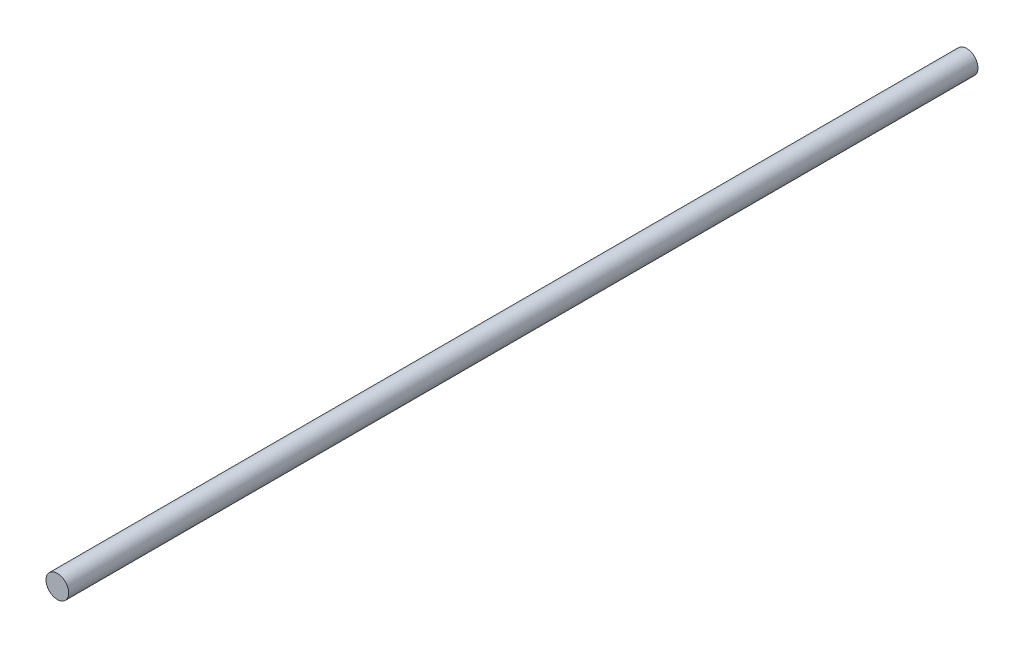
ISO-10303-21;
HEADER;
FILE_DESCRIPTION(('STEP AP214'),'2;1');
FILE_NAME('part.step','',(''),(''),'','','');
FILE_SCHEMA(('AUTOMOTIVE_DESIGN { 1 0 10303 214 1 1 1 1 }'));
ENDSEC;
DATA;
#1=APPLICATION_CONTEXT('core data for automotive mechanical design processes');
#2=APPLICATION_PROTOCOL_DEFINITION('international standard','automotive_design',2000,#1);
#3=PRODUCT_CONTEXT('',#1,'mechanical');
#4=PRODUCT('Part','Part','',(#3));
#5=PRODUCT_RELATED_PRODUCT_CATEGORY('part','',(#4));
#6=PRODUCT_DEFINITION_FORMATION('','',#4);
#7=PRODUCT_DEFINITION_CONTEXT('part definition',#1,'design');
#8=PRODUCT_DEFINITION('design','',#6,#7);
#9=PRODUCT_DEFINITION_SHAPE('','',#8);
#10=(LENGTH_UNIT() NAMED_UNIT(*) SI_UNIT(.MILLI.,.METRE.));
#11=(NAMED_UNIT(*) PLANE_ANGLE_UNIT() SI_UNIT($,.RADIAN.));
#12=(NAMED_UNIT(*) SI_UNIT($,.STERADIAN.) SOLID_ANGLE_UNIT());
#13=UNCERTAINTY_MEASURE_WITH_UNIT(LENGTH_MEASURE(1.E-05),#10,'distance_accuracy_value','');
#14=(GEOMETRIC_REPRESENTATION_CONTEXT(3) GLOBAL_UNCERTAINTY_ASSIGNED_CONTEXT((#13)) GLOBAL_UNIT_ASSIGNED_CONTEXT((#10,
#11,#12)) REPRESENTATION_CONTEXT('',''));
#15=CARTESIAN_POINT('',(0.,0.,0.));
#16=DIRECTION('',(0.,0.,1.));
#17=DIRECTION('',(1.,0.,0.));
#18=AXIS2_PLACEMENT_3D('',#15,#16,#17);
#19=CARTESIAN_POINT('',(35.,-7.49999999999999,-145.));
#20=DIRECTION('',(0.,0.,1.));
#21=DIRECTION('',(1.,0.,0.));
#22=AXIS2_PLACEMENT_3D('',#19,#20,#21);
#23=CYLINDRICAL_SURFACE('',#22,2.);
#24=CARTESIAN_POINT('',(35.,-7.49999999999999,-145.));
#25=DIRECTION('',(0.,0.,1.));
#26=DIRECTION('',(1.,0.,0.));
#27=AXIS2_PLACEMENT_3D('',#24,#25,#26);
#28=CIRCLE('',#27,2.);
#29=CARTESIAN_POINT('',(37.,-7.49999999999999,-145.));
#30=VERTEX_POINT('',#29);
#31=EDGE_CURVE('E10',#30,#30,#28,.T.);
#32=ORIENTED_EDGE('',*,*,#31,.T.);
#33=EDGE_LOOP('',(#32));
#34=FACE_BOUND('',#33,.T.);
#35=CARTESIAN_POINT('',(35.,-7.49999999999999,15.));
#36=DIRECTION('',(0.,0.,1.));
#37=DIRECTION('',(1.,0.,0.));
#38=AXIS2_PLACEMENT_3D('',#35,#36,#37);
#39=CIRCLE('',#38,2.);
#40=CARTESIAN_POINT('',(37.,-7.49999999999999,15.));
#41=VERTEX_POINT('',#40);
#42=EDGE_CURVE('E37',#41,#41,#39,.T.);
#43=ORIENTED_EDGE('',*,*,#42,.F.);
#44=EDGE_LOOP('',(#43));
#45=FACE_BOUND('',#44,.T.);
#46=ADVANCED_FACE('F31',(#34,#45),#23,.T.);
#47=CARTESIAN_POINT('',(35.,-7.49999999999999,-145.));
#48=DIRECTION('',(0.,0.,1.));
#49=DIRECTION('',(1.,0.,0.));
#50=AXIS2_PLACEMENT_3D('',#47,#48,#49);
#51=PLANE('',#50);
#52=ORIENTED_EDGE('',*,*,#31,.F.);
#53=EDGE_LOOP('',(#52));
#54=FACE_BOUND('',#53,.T.);
#55=ADVANCED_FACE('F46',(#54),#51,.F.);
#56=CARTESIAN_POINT('',(35.,-7.49999999999999,15.));
#57=DIRECTION('',(0.,0.,1.));
#58=DIRECTION('',(1.,0.,0.));
#59=AXIS2_PLACEMENT_3D('',#56,#57,#58);
#60=PLANE('',#59);
#61=ORIENTED_EDGE('',*,*,#42,.T.);
#62=EDGE_LOOP('',(#61));
#63=FACE_BOUND('',#62,.T.);
#64=ADVANCED_FACE('F43',(#63),#60,.T.);
#65=CLOSED_SHELL('',(#46,#55,#64));
#66=MANIFOLD_SOLID_BREP('B2',#65);
#67=ADVANCED_BREP_SHAPE_REPRESENTATION('',(#18,#66),#14);
#68=SHAPE_DEFINITION_REPRESENTATION(#9,#67);
ENDSEC;
END-ISO-10303-21;
